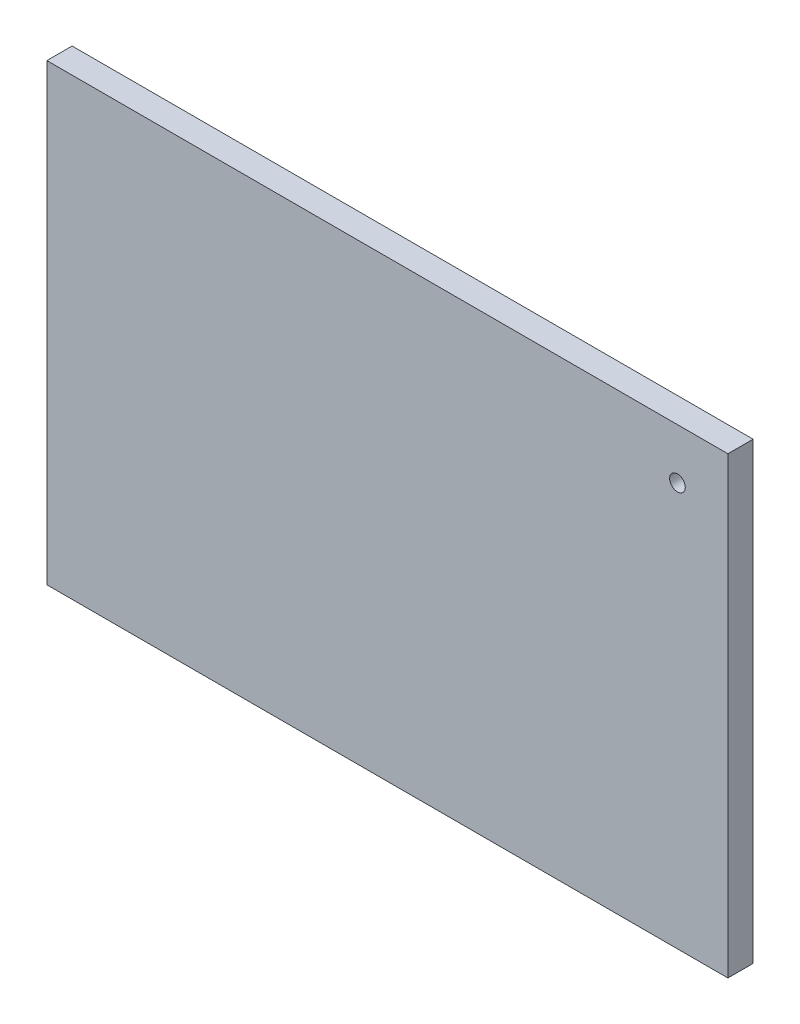
ISO-10303-21;
HEADER;
FILE_DESCRIPTION(('STEP AP214'),'2;1');
FILE_NAME('part.step','',(''),(''),'','','');
FILE_SCHEMA(('AUTOMOTIVE_DESIGN { 1 0 10303 214 1 1 1 1 }'));
ENDSEC;
DATA;
#1=APPLICATION_CONTEXT('core data for automotive mechanical design processes');
#2=APPLICATION_PROTOCOL_DEFINITION('international standard','automotive_design',2000,#1);
#3=PRODUCT_CONTEXT('',#1,'mechanical');
#4=PRODUCT('Part','Part','',(#3));
#5=PRODUCT_RELATED_PRODUCT_CATEGORY('part','',(#4));
#6=PRODUCT_DEFINITION_FORMATION('','',#4);
#7=PRODUCT_DEFINITION_CONTEXT('part definition',#1,'design');
#8=PRODUCT_DEFINITION('design','',#6,#7);
#9=PRODUCT_DEFINITION_SHAPE('','',#8);
#10=(LENGTH_UNIT() NAMED_UNIT(*) SI_UNIT(.MILLI.,.METRE.));
#11=(NAMED_UNIT(*) PLANE_ANGLE_UNIT() SI_UNIT($,.RADIAN.));
#12=(NAMED_UNIT(*) SI_UNIT($,.STERADIAN.) SOLID_ANGLE_UNIT());
#13=UNCERTAINTY_MEASURE_WITH_UNIT(LENGTH_MEASURE(1.E-05),#10,'distance_accuracy_value','');
#14=(GEOMETRIC_REPRESENTATION_CONTEXT(3) GLOBAL_UNCERTAINTY_ASSIGNED_CONTEXT((#13)) GLOBAL_UNIT_ASSIGNED_CONTEXT((#10,
#11,#12)) REPRESENTATION_CONTEXT('',''));
#15=CARTESIAN_POINT('',(0.,0.,0.));
#16=DIRECTION('',(0.,0.,1.));
#17=DIRECTION('',(1.,0.,0.));
#18=AXIS2_PLACEMENT_3D('',#15,#16,#17);
#19=CARTESIAN_POINT('',(0.,0.,5.));
#20=DIRECTION('',(0.,0.,-1.));
#21=DIRECTION('',(-1.,0.,0.));
#22=AXIS2_PLACEMENT_3D('',#19,#20,#21);
#23=PLANE('',#22);
#24=DIRECTION('',(0.,1.,0.));
#25=VECTOR('',#24,1.);
#26=CARTESIAN_POINT('',(67.5,-45.,5.));
#27=LINE('',#26,#25);
#28=CARTESIAN_POINT('',(67.5,-45.,5.));
#29=VERTEX_POINT('',#28);
#30=CARTESIAN_POINT('',(67.5,45.,5.));
#31=VERTEX_POINT('',#30);
#32=EDGE_CURVE('E85',#29,#31,#27,.T.);
#33=ORIENTED_EDGE('',*,*,#32,.T.);
#34=DIRECTION('',(-1.,0.,0.));
#35=VECTOR('',#34,1.);
#36=CARTESIAN_POINT('',(-67.5,45.,5.));
#37=LINE('',#36,#35);
#38=CARTESIAN_POINT('',(-67.5,45.,5.));
#39=VERTEX_POINT('',#38);
#40=EDGE_CURVE('E80',#31,#39,#37,.T.);
#41=ORIENTED_EDGE('',*,*,#40,.T.);
#42=DIRECTION('',(0.,-1.,0.));
#43=VECTOR('',#42,1.);
#44=CARTESIAN_POINT('',(-67.5,-45.,5.));
#45=LINE('',#44,#43);
#46=CARTESIAN_POINT('',(-67.5,-45.,5.));
#47=VERTEX_POINT('',#46);
#48=EDGE_CURVE('E83',#39,#47,#45,.T.);
#49=ORIENTED_EDGE('',*,*,#48,.T.);
#50=DIRECTION('',(1.,0.,0.));
#51=VECTOR('',#50,1.);
#52=CARTESIAN_POINT('',(-67.5,-45.,5.));
#53=LINE('',#52,#51);
#54=EDGE_CURVE('E50',#47,#29,#53,.T.);
#55=ORIENTED_EDGE('',*,*,#54,.T.);
#56=EDGE_LOOP('',(#33,#41,#49,#55));
#57=FACE_BOUND('',#56,.T.);
#58=CARTESIAN_POINT('',(57.5,35.,5.));
#59=DIRECTION('',(0.,0.,1.));
#60=DIRECTION('',(1.,0.,0.));
#61=AXIS2_PLACEMENT_3D('',#58,#59,#60);
#62=CIRCLE('',#61,1.54999999999999);
#63=CARTESIAN_POINT('',(59.05,35.,5.));
#64=VERTEX_POINT('',#63);
#65=EDGE_CURVE('E100',#64,#64,#62,.T.);
#66=ORIENTED_EDGE('',*,*,#65,.F.);
#67=EDGE_LOOP('',(#66));
#68=FACE_BOUND('',#67,.T.);
#69=ADVANCED_FACE('F33',(#57,#68),#23,.F.);
#70=CARTESIAN_POINT('',(0.,0.,0.));
#71=DIRECTION('',(0.,0.,-1.));
#72=DIRECTION('',(-1.,0.,0.));
#73=AXIS2_PLACEMENT_3D('',#70,#71,#72);
#74=PLANE('',#73);
#75=DIRECTION('',(0.,1.,0.));
#76=VECTOR('',#75,1.);
#77=CARTESIAN_POINT('',(67.5,-45.,0.));
#78=LINE('',#77,#76);
#79=CARTESIAN_POINT('',(67.5,-45.,0.));
#80=VERTEX_POINT('',#79);
#81=CARTESIAN_POINT('',(67.5,45.,0.));
#82=VERTEX_POINT('',#81);
#83=EDGE_CURVE('E97',#80,#82,#78,.T.);
#84=ORIENTED_EDGE('',*,*,#83,.F.);
#85=DIRECTION('',(1.,0.,0.));
#86=VECTOR('',#85,1.);
#87=CARTESIAN_POINT('',(-67.5,-45.,0.));
#88=LINE('',#87,#86);
#89=CARTESIAN_POINT('',(-67.5,-45.,0.));
#90=VERTEX_POINT('',#89);
#91=EDGE_CURVE('E73',#90,#80,#88,.T.);
#92=ORIENTED_EDGE('',*,*,#91,.F.);
#93=DIRECTION('',(0.,-1.,0.));
#94=VECTOR('',#93,1.);
#95=CARTESIAN_POINT('',(-67.5,-45.,0.));
#96=LINE('',#95,#94);
#97=CARTESIAN_POINT('',(-67.5,45.,0.));
#98=VERTEX_POINT('',#97);
#99=EDGE_CURVE('E67',#98,#90,#96,.T.);
#100=ORIENTED_EDGE('',*,*,#99,.F.);
#101=DIRECTION('',(-1.,0.,0.));
#102=VECTOR('',#101,1.);
#103=CARTESIAN_POINT('',(-67.5,45.,0.));
#104=LINE('',#103,#102);
#105=EDGE_CURVE('E89',#82,#98,#104,.T.);
#106=ORIENTED_EDGE('',*,*,#105,.F.);
#107=EDGE_LOOP('',(#84,#92,#100,#106));
#108=FACE_BOUND('',#107,.T.);
#109=CARTESIAN_POINT('',(57.5,35.,0.));
#110=DIRECTION('',(0.,0.,1.));
#111=DIRECTION('',(1.,0.,0.));
#112=AXIS2_PLACEMENT_3D('',#109,#110,#111);
#113=CIRCLE('',#112,1.54999999999999);
#114=CARTESIAN_POINT('',(59.05,35.,0.));
#115=VERTEX_POINT('',#114);
#116=EDGE_CURVE('E112',#115,#115,#113,.T.);
#117=ORIENTED_EDGE('',*,*,#116,.T.);
#118=EDGE_LOOP('',(#117));
#119=FACE_BOUND('',#118,.T.);
#120=ADVANCED_FACE('F108',(#108,#119),#74,.T.);
#121=CARTESIAN_POINT('',(67.5,-45.,5.));
#122=DIRECTION('',(-1.,0.,0.));
#123=DIRECTION('',(0.,0.,1.));
#124=AXIS2_PLACEMENT_3D('',#121,#122,#123);
#125=PLANE('',#124);
#126=ORIENTED_EDGE('',*,*,#83,.T.);
#127=DIRECTION('',(0.,0.,-1.));
#128=VECTOR('',#127,1.);
#129=CARTESIAN_POINT('',(67.5,45.,5.));
#130=LINE('',#129,#128);
#131=EDGE_CURVE('E11',#31,#82,#130,.T.);
#132=ORIENTED_EDGE('',*,*,#131,.F.);
#133=ORIENTED_EDGE('',*,*,#32,.F.);
#134=DIRECTION('',(0.,0.,-1.));
#135=VECTOR('',#134,1.);
#136=CARTESIAN_POINT('',(67.5,-45.,5.));
#137=LINE('',#136,#135);
#138=EDGE_CURVE('E93',#29,#80,#137,.T.);
#139=ORIENTED_EDGE('',*,*,#138,.T.);
#140=EDGE_LOOP('',(#126,#132,#133,#139));
#141=FACE_BOUND('',#140,.T.);
#142=ADVANCED_FACE('F35',(#141),#125,.F.);
#143=CARTESIAN_POINT('',(-67.5,45.,5.));
#144=DIRECTION('',(0.,-1.,0.));
#145=DIRECTION('',(0.,0.,-1.));
#146=AXIS2_PLACEMENT_3D('',#143,#144,#145);
#147=PLANE('',#146);
#148=ORIENTED_EDGE('',*,*,#105,.T.);
#149=DIRECTION('',(0.,0.,-1.));
#150=VECTOR('',#149,1.);
#151=CARTESIAN_POINT('',(-67.5,45.,5.));
#152=LINE('',#151,#150);
#153=EDGE_CURVE('E42',#39,#98,#152,.T.);
#154=ORIENTED_EDGE('',*,*,#153,.F.);
#155=ORIENTED_EDGE('',*,*,#40,.F.);
#156=ORIENTED_EDGE('',*,*,#131,.T.);
#157=EDGE_LOOP('',(#148,#154,#155,#156));
#158=FACE_BOUND('',#157,.T.);
#159=ADVANCED_FACE('F88',(#158),#147,.F.);
#160=CARTESIAN_POINT('',(-67.5,-45.,5.));
#161=DIRECTION('',(1.,0.,0.));
#162=DIRECTION('',(0.,0.,-1.));
#163=AXIS2_PLACEMENT_3D('',#160,#161,#162);
#164=PLANE('',#163);
#165=ORIENTED_EDGE('',*,*,#99,.T.);
#166=DIRECTION('',(0.,0.,-1.));
#167=VECTOR('',#166,1.);
#168=CARTESIAN_POINT('',(-67.5,-45.,5.));
#169=LINE('',#168,#167);
#170=EDGE_CURVE('E90',#47,#90,#169,.T.);
#171=ORIENTED_EDGE('',*,*,#170,.F.);
#172=ORIENTED_EDGE('',*,*,#48,.F.);
#173=ORIENTED_EDGE('',*,*,#153,.T.);
#174=EDGE_LOOP('',(#165,#171,#172,#173));
#175=FACE_BOUND('',#174,.T.);
#176=ADVANCED_FACE('F91',(#175),#164,.F.);
#177=CARTESIAN_POINT('',(-67.5,-45.,5.));
#178=DIRECTION('',(0.,1.,0.));
#179=DIRECTION('',(0.,0.,1.));
#180=AXIS2_PLACEMENT_3D('',#177,#178,#179);
#181=PLANE('',#180);
#182=ORIENTED_EDGE('',*,*,#91,.T.);
#183=ORIENTED_EDGE('',*,*,#138,.F.);
#184=ORIENTED_EDGE('',*,*,#54,.F.);
#185=ORIENTED_EDGE('',*,*,#170,.T.);
#186=EDGE_LOOP('',(#182,#183,#184,#185));
#187=FACE_BOUND('',#186,.T.);
#188=ADVANCED_FACE('F105',(#187),#181,.F.);
#189=CARTESIAN_POINT('',(57.5,35.,5.));
#190=DIRECTION('',(0.,0.,-1.));
#191=DIRECTION('',(-1.,0.,0.));
#192=AXIS2_PLACEMENT_3D('',#189,#190,#191);
#193=CYLINDRICAL_SURFACE('',#192,1.54999999999999);
#194=ORIENTED_EDGE('',*,*,#65,.T.);
#195=EDGE_LOOP('',(#194));
#196=FACE_BOUND('',#195,.T.);
#197=ORIENTED_EDGE('',*,*,#116,.F.);
#198=EDGE_LOOP('',(#197));
#199=FACE_BOUND('',#198,.T.);
#200=ADVANCED_FACE('F118',(#196,#199),#193,.F.);
#201=CLOSED_SHELL('',(#69,#120,#142,#159,#176,#188,#200));
#202=MANIFOLD_SOLID_BREP('B2',#201);
#203=ADVANCED_BREP_SHAPE_REPRESENTATION('',(#18,#202),#14);
#204=SHAPE_DEFINITION_REPRESENTATION(#9,#203);
ENDSEC;
END-ISO-10303-21;
